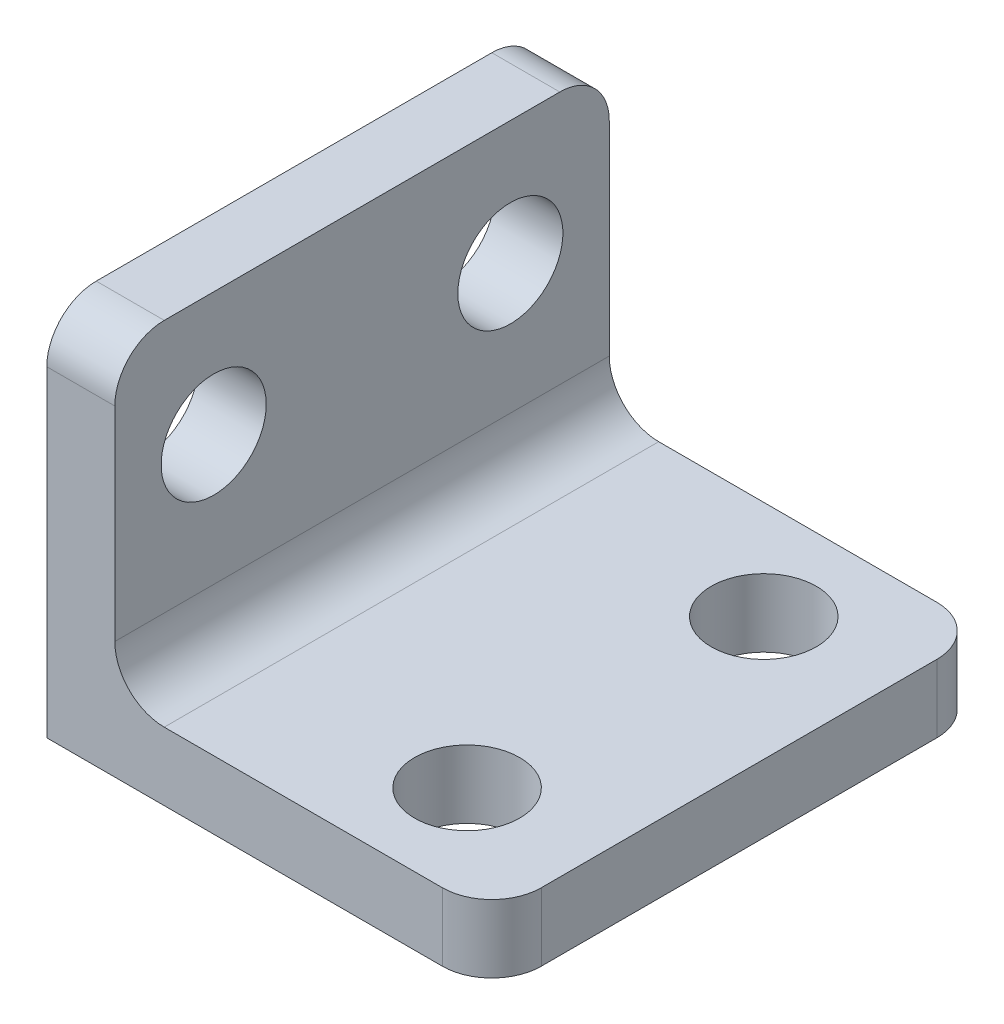
ISO-10303-21;
HEADER;
FILE_DESCRIPTION(('STEP AP214'),'2;1');
FILE_NAME('part.step','',(''),(''),'','','');
FILE_SCHEMA(('AUTOMOTIVE_DESIGN { 1 0 10303 214 1 1 1 1 }'));
ENDSEC;
DATA;
#1=APPLICATION_CONTEXT('core data for automotive mechanical design processes');
#2=APPLICATION_PROTOCOL_DEFINITION('international standard','automotive_design',2000,#1);
#3=PRODUCT_CONTEXT('',#1,'mechanical');
#4=PRODUCT('Part','Part','',(#3));
#5=PRODUCT_RELATED_PRODUCT_CATEGORY('part','',(#4));
#6=PRODUCT_DEFINITION_FORMATION('','',#4);
#7=PRODUCT_DEFINITION_CONTEXT('part definition',#1,'design');
#8=PRODUCT_DEFINITION('design','',#6,#7);
#9=PRODUCT_DEFINITION_SHAPE('','',#8);
#10=(LENGTH_UNIT() NAMED_UNIT(*) SI_UNIT(.MILLI.,.METRE.));
#11=(NAMED_UNIT(*) PLANE_ANGLE_UNIT() SI_UNIT($,.RADIAN.));
#12=(NAMED_UNIT(*) SI_UNIT($,.STERADIAN.) SOLID_ANGLE_UNIT());
#13=UNCERTAINTY_MEASURE_WITH_UNIT(LENGTH_MEASURE(1.E-05),#10,'distance_accuracy_value','');
#14=(GEOMETRIC_REPRESENTATION_CONTEXT(3) GLOBAL_UNCERTAINTY_ASSIGNED_CONTEXT((#13)) GLOBAL_UNIT_ASSIGNED_CONTEXT((#10,
#11,#12)) REPRESENTATION_CONTEXT('',''));
#15=CARTESIAN_POINT('',(0.,0.,0.));
#16=DIRECTION('',(0.,0.,1.));
#17=DIRECTION('',(1.,0.,0.));
#18=AXIS2_PLACEMENT_3D('',#15,#16,#17);
#19=CARTESIAN_POINT('',(0.,2.75,0.));
#20=DIRECTION('',(0.,-1.,0.));
#21=DIRECTION('',(0.,0.,-1.));
#22=AXIS2_PLACEMENT_3D('',#19,#20,#21);
#23=PLANE('',#22);
#24=DIRECTION('',(-1.,0.,0.));
#25=VECTOR('',#24,1.);
#26=CARTESIAN_POINT('',(-3.,2.75,-10.));
#27=LINE('',#26,#25);
#28=CARTESIAN_POINT('',(13.,2.75,-10.));
#29=VERTEX_POINT('',#28);
#30=CARTESIAN_POINT('',(1.75,2.75,-10.));
#31=VERTEX_POINT('',#30);
#32=EDGE_CURVE('E243',#29,#31,#27,.T.);
#33=ORIENTED_EDGE('',*,*,#32,.T.);
#34=DIRECTION('',(0.,0.,1.));
#35=VECTOR('',#34,1.);
#36=CARTESIAN_POINT('',(1.75,2.75,0.));
#37=LINE('',#36,#35);
#38=CARTESIAN_POINT('',(1.75,2.75,10.));
#39=VERTEX_POINT('',#38);
#40=EDGE_CURVE('E171',#31,#39,#37,.T.);
#41=ORIENTED_EDGE('',*,*,#40,.T.);
#42=DIRECTION('',(1.,0.,0.));
#43=VECTOR('',#42,1.);
#44=CARTESIAN_POINT('',(-3.,2.75,10.));
#45=LINE('',#44,#43);
#46=CARTESIAN_POINT('',(13.,2.75,10.));
#47=VERTEX_POINT('',#46);
#48=EDGE_CURVE('E164',#39,#47,#45,.T.);
#49=ORIENTED_EDGE('',*,*,#48,.T.);
#50=CARTESIAN_POINT('',(13.,2.75,8.));
#51=DIRECTION('',(0.,-1.,0.));
#52=DIRECTION('',(0.,0.,-1.));
#53=AXIS2_PLACEMENT_3D('',#50,#51,#52);
#54=CIRCLE('',#53,2.);
#55=CARTESIAN_POINT('',(15.,2.75,8.));
#56=VERTEX_POINT('',#55);
#57=EDGE_CURVE('E138',#47,#56,#54,.F.);
#58=ORIENTED_EDGE('',*,*,#57,.T.);
#59=DIRECTION('',(0.,0.,-1.));
#60=VECTOR('',#59,1.);
#61=CARTESIAN_POINT('',(15.,2.75,10.));
#62=LINE('',#61,#60);
#63=CARTESIAN_POINT('',(15.,2.75,-8.));
#64=VERTEX_POINT('',#63);
#65=EDGE_CURVE('E159',#56,#64,#62,.T.);
#66=ORIENTED_EDGE('',*,*,#65,.T.);
#67=CARTESIAN_POINT('',(13.,2.75,-8.));
#68=DIRECTION('',(0.,-1.,0.));
#69=DIRECTION('',(0.,0.,-1.));
#70=AXIS2_PLACEMENT_3D('',#67,#68,#69);
#71=CIRCLE('',#70,2.);
#72=EDGE_CURVE('E168',#64,#29,#71,.F.);
#73=ORIENTED_EDGE('',*,*,#72,.T.);
#74=EDGE_LOOP('',(#33,#41,#49,#58,#66,#73));
#75=FACE_BOUND('',#74,.T.);
#76=CARTESIAN_POINT('',(10.,2.75,-6.));
#77=DIRECTION('',(0.,1.,0.));
#78=DIRECTION('',(0.,0.,1.));
#79=AXIS2_PLACEMENT_3D('',#76,#77,#78);
#80=CIRCLE('',#79,2.125);
#81=CARTESIAN_POINT('',(10.,2.75,-3.875));
#82=VERTEX_POINT('',#81);
#83=EDGE_CURVE('E257',#82,#82,#80,.T.);
#84=ORIENTED_EDGE('',*,*,#83,.F.);
#85=EDGE_LOOP('',(#84));
#86=FACE_BOUND('',#85,.T.);
#87=CARTESIAN_POINT('',(10.,2.75,6.));
#88=DIRECTION('',(0.,1.,0.));
#89=DIRECTION('',(0.,0.,-1.));
#90=AXIS2_PLACEMENT_3D('',#87,#88,#89);
#91=CIRCLE('',#90,2.125);
#92=CARTESIAN_POINT('',(10.,2.75,3.875));
#93=VERTEX_POINT('',#92);
#94=EDGE_CURVE('E269',#93,#93,#91,.T.);
#95=ORIENTED_EDGE('',*,*,#94,.F.);
#96=EDGE_LOOP('',(#95));
#97=FACE_BOUND('',#96,.T.);
#98=ADVANCED_FACE('F45',(#75,#86,#97),#23,.F.);
#99=CARTESIAN_POINT('',(0.,0.,0.));
#100=DIRECTION('',(0.,-1.,0.));
#101=DIRECTION('',(0.,0.,-1.));
#102=AXIS2_PLACEMENT_3D('',#99,#100,#101);
#103=PLANE('',#102);
#104=DIRECTION('',(-1.,0.,0.));
#105=VECTOR('',#104,1.);
#106=CARTESIAN_POINT('',(-3.,0.,-10.));
#107=LINE('',#106,#105);
#108=CARTESIAN_POINT('',(13.,0.,-10.));
#109=VERTEX_POINT('',#108);
#110=CARTESIAN_POINT('',(-3.,0.,-10.));
#111=VERTEX_POINT('',#110);
#112=EDGE_CURVE('E143',#109,#111,#107,.T.);
#113=ORIENTED_EDGE('',*,*,#112,.F.);
#114=CARTESIAN_POINT('',(13.,0.,-8.));
#115=DIRECTION('',(0.,-1.,0.));
#116=DIRECTION('',(0.,0.,-1.));
#117=AXIS2_PLACEMENT_3D('',#114,#115,#116);
#118=CIRCLE('',#117,2.);
#119=CARTESIAN_POINT('',(15.,0.,-8.));
#120=VERTEX_POINT('',#119);
#121=EDGE_CURVE('E192',#109,#120,#118,.T.);
#122=ORIENTED_EDGE('',*,*,#121,.T.);
#123=DIRECTION('',(0.,0.,-1.));
#124=VECTOR('',#123,1.);
#125=CARTESIAN_POINT('',(15.,0.,10.));
#126=LINE('',#125,#124);
#127=CARTESIAN_POINT('',(15.,0.,8.));
#128=VERTEX_POINT('',#127);
#129=EDGE_CURVE('E150',#128,#120,#126,.T.);
#130=ORIENTED_EDGE('',*,*,#129,.F.);
#131=CARTESIAN_POINT('',(13.,0.,8.));
#132=DIRECTION('',(0.,-1.,0.));
#133=DIRECTION('',(0.,0.,-1.));
#134=AXIS2_PLACEMENT_3D('',#131,#132,#133);
#135=CIRCLE('',#134,2.);
#136=CARTESIAN_POINT('',(13.,0.,10.));
#137=VERTEX_POINT('',#136);
#138=EDGE_CURVE('E189',#128,#137,#135,.T.);
#139=ORIENTED_EDGE('',*,*,#138,.T.);
#140=DIRECTION('',(1.,0.,0.));
#141=VECTOR('',#140,1.);
#142=CARTESIAN_POINT('',(-3.,0.,10.));
#143=LINE('',#142,#141);
#144=CARTESIAN_POINT('',(-3.,0.,10.));
#145=VERTEX_POINT('',#144);
#146=EDGE_CURVE('E155',#145,#137,#143,.T.);
#147=ORIENTED_EDGE('',*,*,#146,.F.);
#148=DIRECTION('',(0.,0.,1.));
#149=VECTOR('',#148,1.);
#150=CARTESIAN_POINT('',(-3.,0.,-10.));
#151=LINE('',#150,#149);
#152=EDGE_CURVE('E134',#111,#145,#151,.T.);
#153=ORIENTED_EDGE('',*,*,#152,.F.);
#154=EDGE_LOOP('',(#113,#122,#130,#139,#147,#153));
#155=FACE_BOUND('',#154,.T.);
#156=CARTESIAN_POINT('',(10.,0.,-6.));
#157=DIRECTION('',(0.,1.,0.));
#158=DIRECTION('',(0.,0.,1.));
#159=AXIS2_PLACEMENT_3D('',#156,#157,#158);
#160=CIRCLE('',#159,2.125);
#161=CARTESIAN_POINT('',(10.,0.,-3.875));
#162=VERTEX_POINT('',#161);
#163=EDGE_CURVE('E263',#162,#162,#160,.T.);
#164=ORIENTED_EDGE('',*,*,#163,.T.);
#165=EDGE_LOOP('',(#164));
#166=FACE_BOUND('',#165,.T.);
#167=CARTESIAN_POINT('',(10.,0.,6.));
#168=DIRECTION('',(0.,1.,0.));
#169=DIRECTION('',(0.,0.,-1.));
#170=AXIS2_PLACEMENT_3D('',#167,#168,#169);
#171=CIRCLE('',#170,2.125);
#172=CARTESIAN_POINT('',(10.,0.,3.875));
#173=VERTEX_POINT('',#172);
#174=EDGE_CURVE('E271',#173,#173,#171,.T.);
#175=ORIENTED_EDGE('',*,*,#174,.T.);
#176=EDGE_LOOP('',(#175));
#177=FACE_BOUND('',#176,.T.);
#178=ADVANCED_FACE('F152',(#155,#166,#177),#103,.T.);
#179=CARTESIAN_POINT('',(15.,2.75,10.));
#180=DIRECTION('',(-1.,0.,0.));
#181=DIRECTION('',(0.,0.,1.));
#182=AXIS2_PLACEMENT_3D('',#179,#180,#181);
#183=PLANE('',#182);
#184=ORIENTED_EDGE('',*,*,#129,.T.);
#185=DIRECTION('',(0.,-1.,0.));
#186=VECTOR('',#185,1.);
#187=CARTESIAN_POINT('',(15.,2.75,-8.));
#188=LINE('',#187,#186);
#189=EDGE_CURVE('E199',#120,#64,#188,.F.);
#190=ORIENTED_EDGE('',*,*,#189,.T.);
#191=ORIENTED_EDGE('',*,*,#65,.F.);
#192=DIRECTION('',(0.,-1.,0.));
#193=VECTOR('',#192,1.);
#194=CARTESIAN_POINT('',(15.,2.75,8.));
#195=LINE('',#194,#193);
#196=EDGE_CURVE('E195',#56,#128,#195,.T.);
#197=ORIENTED_EDGE('',*,*,#196,.T.);
#198=EDGE_LOOP('',(#184,#190,#191,#197));
#199=FACE_BOUND('',#198,.T.);
#200=ADVANCED_FACE('F332',(#199),#183,.F.);
#201=CARTESIAN_POINT('',(-3.,2.75,-10.));
#202=DIRECTION('',(0.,0.,1.));
#203=DIRECTION('',(1.,0.,0.));
#204=AXIS2_PLACEMENT_3D('',#201,#202,#203);
#205=PLANE('',#204);
#206=ORIENTED_EDGE('',*,*,#32,.F.);
#207=DIRECTION('',(0.,-1.,0.));
#208=VECTOR('',#207,1.);
#209=CARTESIAN_POINT('',(13.,2.75,-10.));
#210=LINE('',#209,#208);
#211=EDGE_CURVE('E147',#29,#109,#210,.T.);
#212=ORIENTED_EDGE('',*,*,#211,.T.);
#213=ORIENTED_EDGE('',*,*,#112,.T.);
#214=DIRECTION('',(0.,-1.,0.));
#215=VECTOR('',#214,1.);
#216=CARTESIAN_POINT('',(-3.,2.75,-10.));
#217=LINE('',#216,#215);
#218=CARTESIAN_POINT('',(-3.,13.,-10.));
#219=VERTEX_POINT('',#218);
#220=EDGE_CURVE('E129',#219,#111,#217,.T.);
#221=ORIENTED_EDGE('',*,*,#220,.F.);
#222=DIRECTION('',(-1.,0.,0.));
#223=VECTOR('',#222,1.);
#224=CARTESIAN_POINT('',(-0.249999999999998,13.,-10.));
#225=LINE('',#224,#223);
#226=CARTESIAN_POINT('',(-0.249999999999998,13.,-10.));
#227=VERTEX_POINT('',#226);
#228=EDGE_CURVE('E184',#219,#227,#225,.F.);
#229=ORIENTED_EDGE('',*,*,#228,.T.);
#230=DIRECTION('',(0.,-1.,0.));
#231=VECTOR('',#230,1.);
#232=CARTESIAN_POINT('',(-0.249999999999998,0.,-10.));
#233=LINE('',#232,#231);
#234=CARTESIAN_POINT('',(-0.249999999999998,4.75,-10.));
#235=VERTEX_POINT('',#234);
#236=EDGE_CURVE('E238',#227,#235,#233,.T.);
#237=ORIENTED_EDGE('',*,*,#236,.T.);
#238=CARTESIAN_POINT('',(1.75,4.75,-10.));
#239=DIRECTION('',(0.,0.,1.));
#240=DIRECTION('',(1.,0.,0.));
#241=AXIS2_PLACEMENT_3D('',#238,#239,#240);
#242=CIRCLE('',#241,2.);
#243=EDGE_CURVE('E11',#235,#31,#242,.T.);
#244=ORIENTED_EDGE('',*,*,#243,.T.);
#245=EDGE_LOOP('',(#206,#212,#213,#221,#229,#237,#244));
#246=FACE_BOUND('',#245,.T.);
#247=ADVANCED_FACE('F145',(#246),#205,.F.);
#248=CARTESIAN_POINT('',(-3.,2.75,-10.));
#249=DIRECTION('',(1.,0.,0.));
#250=DIRECTION('',(0.,0.,-1.));
#251=AXIS2_PLACEMENT_3D('',#248,#249,#250);
#252=PLANE('',#251);
#253=DIRECTION('',(0.,0.,-1.));
#254=VECTOR('',#253,1.);
#255=CARTESIAN_POINT('',(-3.,15.,-10.));
#256=LINE('',#255,#254);
#257=CARTESIAN_POINT('',(-3.,15.,8.));
#258=VERTEX_POINT('',#257);
#259=CARTESIAN_POINT('',(-3.,15.,-8.));
#260=VERTEX_POINT('',#259);
#261=EDGE_CURVE('E278',#258,#260,#256,.T.);
#262=ORIENTED_EDGE('',*,*,#261,.T.);
#263=CARTESIAN_POINT('',(-3.,13.,-8.));
#264=DIRECTION('',(1.,0.,0.));
#265=DIRECTION('',(0.,0.,-1.));
#266=AXIS2_PLACEMENT_3D('',#263,#264,#265);
#267=CIRCLE('',#266,2.);
#268=EDGE_CURVE('E61',#260,#219,#267,.F.);
#269=ORIENTED_EDGE('',*,*,#268,.T.);
#270=ORIENTED_EDGE('',*,*,#220,.T.);
#271=ORIENTED_EDGE('',*,*,#152,.T.);
#272=DIRECTION('',(0.,-1.,0.));
#273=VECTOR('',#272,1.);
#274=CARTESIAN_POINT('',(-3.,2.75,10.));
#275=LINE('',#274,#273);
#276=CARTESIAN_POINT('',(-3.,13.,10.));
#277=VERTEX_POINT('',#276);
#278=EDGE_CURVE('E139',#277,#145,#275,.T.);
#279=ORIENTED_EDGE('',*,*,#278,.F.);
#280=CARTESIAN_POINT('',(-3.,13.,8.));
#281=DIRECTION('',(1.,0.,0.));
#282=DIRECTION('',(0.,0.,-1.));
#283=AXIS2_PLACEMENT_3D('',#280,#281,#282);
#284=CIRCLE('',#283,2.);
#285=EDGE_CURVE('E69',#277,#258,#284,.F.);
#286=ORIENTED_EDGE('',*,*,#285,.T.);
#287=EDGE_LOOP('',(#262,#269,#270,#271,#279,#286));
#288=FACE_BOUND('',#287,.T.);
#289=CARTESIAN_POINT('',(-3.,10.,6.));
#290=DIRECTION('',(-1.,0.,0.));
#291=DIRECTION('',(0.,0.,-1.));
#292=AXIS2_PLACEMENT_3D('',#289,#290,#291);
#293=CIRCLE('',#292,2.125);
#294=CARTESIAN_POINT('',(-3.,10.,3.875));
#295=VERTEX_POINT('',#294);
#296=EDGE_CURVE('E295',#295,#295,#293,.T.);
#297=ORIENTED_EDGE('',*,*,#296,.F.);
#298=EDGE_LOOP('',(#297));
#299=FACE_BOUND('',#298,.T.);
#300=CARTESIAN_POINT('',(-3.,10.,-6.));
#301=DIRECTION('',(-1.,0.,0.));
#302=DIRECTION('',(0.,0.,1.));
#303=AXIS2_PLACEMENT_3D('',#300,#301,#302);
#304=CIRCLE('',#303,2.125);
#305=CARTESIAN_POINT('',(-3.,10.,-3.875));
#306=VERTEX_POINT('',#305);
#307=EDGE_CURVE('E287',#306,#306,#304,.T.);
#308=ORIENTED_EDGE('',*,*,#307,.F.);
#309=EDGE_LOOP('',(#308));
#310=FACE_BOUND('',#309,.T.);
#311=ADVANCED_FACE('F131',(#288,#299,#310),#252,.F.);
#312=CARTESIAN_POINT('',(-3.,2.75,10.));
#313=DIRECTION('',(0.,0.,-1.));
#314=DIRECTION('',(-1.,0.,0.));
#315=AXIS2_PLACEMENT_3D('',#312,#313,#314);
#316=PLANE('',#315);
#317=ORIENTED_EDGE('',*,*,#146,.T.);
#318=DIRECTION('',(0.,-1.,0.));
#319=VECTOR('',#318,1.);
#320=CARTESIAN_POINT('',(13.,2.75,10.));
#321=LINE('',#320,#319);
#322=EDGE_CURVE('E206',#137,#47,#321,.F.);
#323=ORIENTED_EDGE('',*,*,#322,.T.);
#324=ORIENTED_EDGE('',*,*,#48,.F.);
#325=CARTESIAN_POINT('',(1.75,4.75,10.));
#326=DIRECTION('',(0.,0.,-1.));
#327=DIRECTION('',(-1.,0.,0.));
#328=AXIS2_PLACEMENT_3D('',#325,#326,#327);
#329=CIRCLE('',#328,2.);
#330=CARTESIAN_POINT('',(-0.249999999999998,4.75,10.));
#331=VERTEX_POINT('',#330);
#332=EDGE_CURVE('E54',#39,#331,#329,.T.);
#333=ORIENTED_EDGE('',*,*,#332,.T.);
#334=DIRECTION('',(0.,1.,0.));
#335=VECTOR('',#334,1.);
#336=CARTESIAN_POINT('',(-0.249999999999998,0.,10.));
#337=LINE('',#336,#335);
#338=CARTESIAN_POINT('',(-0.249999999999998,13.,10.));
#339=VERTEX_POINT('',#338);
#340=EDGE_CURVE('E224',#331,#339,#337,.T.);
#341=ORIENTED_EDGE('',*,*,#340,.T.);
#342=DIRECTION('',(-1.,0.,0.));
#343=VECTOR('',#342,1.);
#344=CARTESIAN_POINT('',(-3.,13.,10.));
#345=LINE('',#344,#343);
#346=EDGE_CURVE('E202',#339,#277,#345,.T.);
#347=ORIENTED_EDGE('',*,*,#346,.T.);
#348=ORIENTED_EDGE('',*,*,#278,.T.);
#349=EDGE_LOOP('',(#317,#323,#324,#333,#341,#347,#348));
#350=FACE_BOUND('',#349,.T.);
#351=ADVANCED_FACE('F223',(#350),#316,.F.);
#352=CARTESIAN_POINT('',(10.,2.75,-6.));
#353=DIRECTION('',(0.,-1.,0.));
#354=DIRECTION('',(0.,0.,-1.));
#355=AXIS2_PLACEMENT_3D('',#352,#353,#354);
#356=CYLINDRICAL_SURFACE('',#355,2.125);
#357=ORIENTED_EDGE('',*,*,#83,.T.);
#358=EDGE_LOOP('',(#357));
#359=FACE_BOUND('',#358,.T.);
#360=ORIENTED_EDGE('',*,*,#163,.F.);
#361=EDGE_LOOP('',(#360));
#362=FACE_BOUND('',#361,.T.);
#363=ADVANCED_FACE('F335',(#359,#362),#356,.F.);
#364=CARTESIAN_POINT('',(10.,2.75,6.));
#365=DIRECTION('',(0.,-1.,0.));
#366=DIRECTION('',(0.,0.,-1.));
#367=AXIS2_PLACEMENT_3D('',#364,#365,#366);
#368=CYLINDRICAL_SURFACE('',#367,2.125);
#369=ORIENTED_EDGE('',*,*,#94,.T.);
#370=EDGE_LOOP('',(#369));
#371=FACE_BOUND('',#370,.T.);
#372=ORIENTED_EDGE('',*,*,#174,.F.);
#373=EDGE_LOOP('',(#372));
#374=FACE_BOUND('',#373,.T.);
#375=ADVANCED_FACE('F415',(#371,#374),#368,.F.);
#376=CARTESIAN_POINT('',(-0.249999999999998,0.,0.));
#377=DIRECTION('',(1.,0.,0.));
#378=DIRECTION('',(0.,0.,-1.));
#379=AXIS2_PLACEMENT_3D('',#376,#377,#378);
#380=PLANE('',#379);
#381=CARTESIAN_POINT('',(-0.249999999999998,10.,-6.));
#382=DIRECTION('',(-1.,0.,0.));
#383=DIRECTION('',(0.,0.,1.));
#384=AXIS2_PLACEMENT_3D('',#381,#382,#383);
#385=CIRCLE('',#384,2.125);
#386=CARTESIAN_POINT('',(-0.249999999999998,10.,-3.875));
#387=VERTEX_POINT('',#386);
#388=EDGE_CURVE('E281',#387,#387,#385,.T.);
#389=ORIENTED_EDGE('',*,*,#388,.T.);
#390=EDGE_LOOP('',(#389));
#391=FACE_BOUND('',#390,.T.);
#392=CARTESIAN_POINT('',(-0.249999999999998,10.,6.));
#393=DIRECTION('',(-1.,0.,0.));
#394=DIRECTION('',(0.,0.,-1.));
#395=AXIS2_PLACEMENT_3D('',#392,#393,#394);
#396=CIRCLE('',#395,2.125);
#397=CARTESIAN_POINT('',(-0.249999999999998,10.,3.875));
#398=VERTEX_POINT('',#397);
#399=EDGE_CURVE('E291',#398,#398,#396,.T.);
#400=ORIENTED_EDGE('',*,*,#399,.T.);
#401=EDGE_LOOP('',(#400));
#402=FACE_BOUND('',#401,.T.);
#403=ORIENTED_EDGE('',*,*,#340,.F.);
#404=DIRECTION('',(0.,0.,1.));
#405=VECTOR('',#404,1.);
#406=CARTESIAN_POINT('',(-0.249999999999998,4.75,0.));
#407=LINE('',#406,#405);
#408=EDGE_CURVE('E181',#331,#235,#407,.F.);
#409=ORIENTED_EDGE('',*,*,#408,.T.);
#410=ORIENTED_EDGE('',*,*,#236,.F.);
#411=CARTESIAN_POINT('',(-0.249999999999998,13.,-8.));
#412=DIRECTION('',(1.,0.,0.));
#413=DIRECTION('',(0.,0.,-1.));
#414=AXIS2_PLACEMENT_3D('',#411,#412,#413);
#415=CIRCLE('',#414,2.);
#416=CARTESIAN_POINT('',(-0.249999999999998,15.,-8.));
#417=VERTEX_POINT('',#416);
#418=EDGE_CURVE('E178',#227,#417,#415,.T.);
#419=ORIENTED_EDGE('',*,*,#418,.T.);
#420=DIRECTION('',(0.,0.,-1.));
#421=VECTOR('',#420,1.);
#422=CARTESIAN_POINT('',(-0.249999999999998,15.,-10.));
#423=LINE('',#422,#421);
#424=CARTESIAN_POINT('',(-0.249999999999998,15.,8.));
#425=VERTEX_POINT('',#424);
#426=EDGE_CURVE('E237',#425,#417,#423,.T.);
#427=ORIENTED_EDGE('',*,*,#426,.F.);
#428=CARTESIAN_POINT('',(-0.249999999999998,13.,8.));
#429=DIRECTION('',(1.,0.,0.));
#430=DIRECTION('',(0.,0.,-1.));
#431=AXIS2_PLACEMENT_3D('',#428,#429,#430);
#432=CIRCLE('',#431,2.);
#433=EDGE_CURVE('E175',#425,#339,#432,.T.);
#434=ORIENTED_EDGE('',*,*,#433,.T.);
#435=EDGE_LOOP('',(#403,#409,#410,#419,#427,#434));
#436=FACE_BOUND('',#435,.T.);
#437=ADVANCED_FACE('F231',(#391,#402,#436),#380,.T.);
#438=CARTESIAN_POINT('',(-0.249999999999998,15.,-10.));
#439=DIRECTION('',(0.,1.,0.));
#440=DIRECTION('',(0.,0.,1.));
#441=AXIS2_PLACEMENT_3D('',#438,#439,#440);
#442=PLANE('',#441);
#443=ORIENTED_EDGE('',*,*,#426,.T.);
#444=DIRECTION('',(-1.,0.,0.));
#445=VECTOR('',#444,1.);
#446=CARTESIAN_POINT('',(-3.,15.,-8.));
#447=LINE('',#446,#445);
#448=EDGE_CURVE('E212',#417,#260,#447,.T.);
#449=ORIENTED_EDGE('',*,*,#448,.T.);
#450=ORIENTED_EDGE('',*,*,#261,.F.);
#451=DIRECTION('',(-1.,0.,0.));
#452=VECTOR('',#451,1.);
#453=CARTESIAN_POINT('',(-0.249999999999998,15.,8.));
#454=LINE('',#453,#452);
#455=EDGE_CURVE('E209',#258,#425,#454,.F.);
#456=ORIENTED_EDGE('',*,*,#455,.T.);
#457=EDGE_LOOP('',(#443,#449,#450,#456));
#458=FACE_BOUND('',#457,.T.);
#459=ADVANCED_FACE('F316',(#458),#442,.T.);
#460=CARTESIAN_POINT('',(-0.249999999999998,10.,-6.));
#461=DIRECTION('',(-1.,0.,0.));
#462=DIRECTION('',(0.,0.,1.));
#463=AXIS2_PLACEMENT_3D('',#460,#461,#462);
#464=CYLINDRICAL_SURFACE('',#463,2.125);
#465=ORIENTED_EDGE('',*,*,#388,.F.);
#466=EDGE_LOOP('',(#465));
#467=FACE_BOUND('',#466,.T.);
#468=ORIENTED_EDGE('',*,*,#307,.T.);
#469=EDGE_LOOP('',(#468));
#470=FACE_BOUND('',#469,.T.);
#471=ADVANCED_FACE('F307',(#467,#470),#464,.F.);
#472=CARTESIAN_POINT('',(-0.249999999999998,10.,6.));
#473=DIRECTION('',(-1.,0.,0.));
#474=DIRECTION('',(0.,0.,1.));
#475=AXIS2_PLACEMENT_3D('',#472,#473,#474);
#476=CYLINDRICAL_SURFACE('',#475,2.125);
#477=ORIENTED_EDGE('',*,*,#399,.F.);
#478=EDGE_LOOP('',(#477));
#479=FACE_BOUND('',#478,.T.);
#480=ORIENTED_EDGE('',*,*,#296,.T.);
#481=EDGE_LOOP('',(#480));
#482=FACE_BOUND('',#481,.T.);
#483=ADVANCED_FACE('F304',(#479,#482),#476,.F.);
#484=CARTESIAN_POINT('',(1.75,4.75,0.));
#485=DIRECTION('',(0.,0.,1.));
#486=DIRECTION('',(1.,0.,0.));
#487=AXIS2_PLACEMENT_3D('',#484,#485,#486);
#488=CYLINDRICAL_SURFACE('',#487,2.);
#489=ORIENTED_EDGE('',*,*,#243,.F.);
#490=ORIENTED_EDGE('',*,*,#408,.F.);
#491=ORIENTED_EDGE('',*,*,#332,.F.);
#492=ORIENTED_EDGE('',*,*,#40,.F.);
#493=EDGE_LOOP('',(#489,#490,#491,#492));
#494=FACE_BOUND('',#493,.T.);
#495=ADVANCED_FACE('F241',(#494),#488,.F.);
#496=CARTESIAN_POINT('',(13.,2.75,-8.));
#497=DIRECTION('',(0.,-1.,0.));
#498=DIRECTION('',(0.,0.,-1.));
#499=AXIS2_PLACEMENT_3D('',#496,#497,#498);
#500=CYLINDRICAL_SURFACE('',#499,2.);
#501=ORIENTED_EDGE('',*,*,#72,.F.);
#502=ORIENTED_EDGE('',*,*,#189,.F.);
#503=ORIENTED_EDGE('',*,*,#121,.F.);
#504=ORIENTED_EDGE('',*,*,#211,.F.);
#505=EDGE_LOOP('',(#501,#502,#503,#504));
#506=FACE_BOUND('',#505,.T.);
#507=ADVANCED_FACE('F346',(#506),#500,.T.);
#508=CARTESIAN_POINT('',(13.,2.75,8.));
#509=DIRECTION('',(0.,-1.,0.));
#510=DIRECTION('',(0.,0.,-1.));
#511=AXIS2_PLACEMENT_3D('',#508,#509,#510);
#512=CYLINDRICAL_SURFACE('',#511,2.);
#513=ORIENTED_EDGE('',*,*,#57,.F.);
#514=ORIENTED_EDGE('',*,*,#322,.F.);
#515=ORIENTED_EDGE('',*,*,#138,.F.);
#516=ORIENTED_EDGE('',*,*,#196,.F.);
#517=EDGE_LOOP('',(#513,#514,#515,#516));
#518=FACE_BOUND('',#517,.T.);
#519=ADVANCED_FACE('F349',(#518),#512,.T.);
#520=CARTESIAN_POINT('',(-0.249999999999998,13.,-8.));
#521=DIRECTION('',(1.,0.,0.));
#522=DIRECTION('',(0.,0.,-1.));
#523=AXIS2_PLACEMENT_3D('',#520,#521,#522);
#524=CYLINDRICAL_SURFACE('',#523,2.);
#525=ORIENTED_EDGE('',*,*,#418,.F.);
#526=ORIENTED_EDGE('',*,*,#228,.F.);
#527=ORIENTED_EDGE('',*,*,#268,.F.);
#528=ORIENTED_EDGE('',*,*,#448,.F.);
#529=EDGE_LOOP('',(#525,#526,#527,#528));
#530=FACE_BOUND('',#529,.T.);
#531=ADVANCED_FACE('F352',(#530),#524,.T.);
#532=CARTESIAN_POINT('',(-3.,13.,8.));
#533=DIRECTION('',(1.,0.,0.));
#534=DIRECTION('',(0.,0.,-1.));
#535=AXIS2_PLACEMENT_3D('',#532,#533,#534);
#536=CYLINDRICAL_SURFACE('',#535,2.);
#537=ORIENTED_EDGE('',*,*,#433,.F.);
#538=ORIENTED_EDGE('',*,*,#455,.F.);
#539=ORIENTED_EDGE('',*,*,#285,.F.);
#540=ORIENTED_EDGE('',*,*,#346,.F.);
#541=EDGE_LOOP('',(#537,#538,#539,#540));
#542=FACE_BOUND('',#541,.T.);
#543=ADVANCED_FACE('F47',(#542),#536,.T.);
#544=CLOSED_SHELL('',(#98,#178,#200,#247,#311,#351,#363,#375,#437,#459,#471,#483,#495,#507,#519,
#531,#543));
#545=MANIFOLD_SOLID_BREP('B2',#544);
#546=ADVANCED_BREP_SHAPE_REPRESENTATION('',(#18,#545),#14);
#547=SHAPE_DEFINITION_REPRESENTATION(#9,#546);
ENDSEC;
END-ISO-10303-21;
